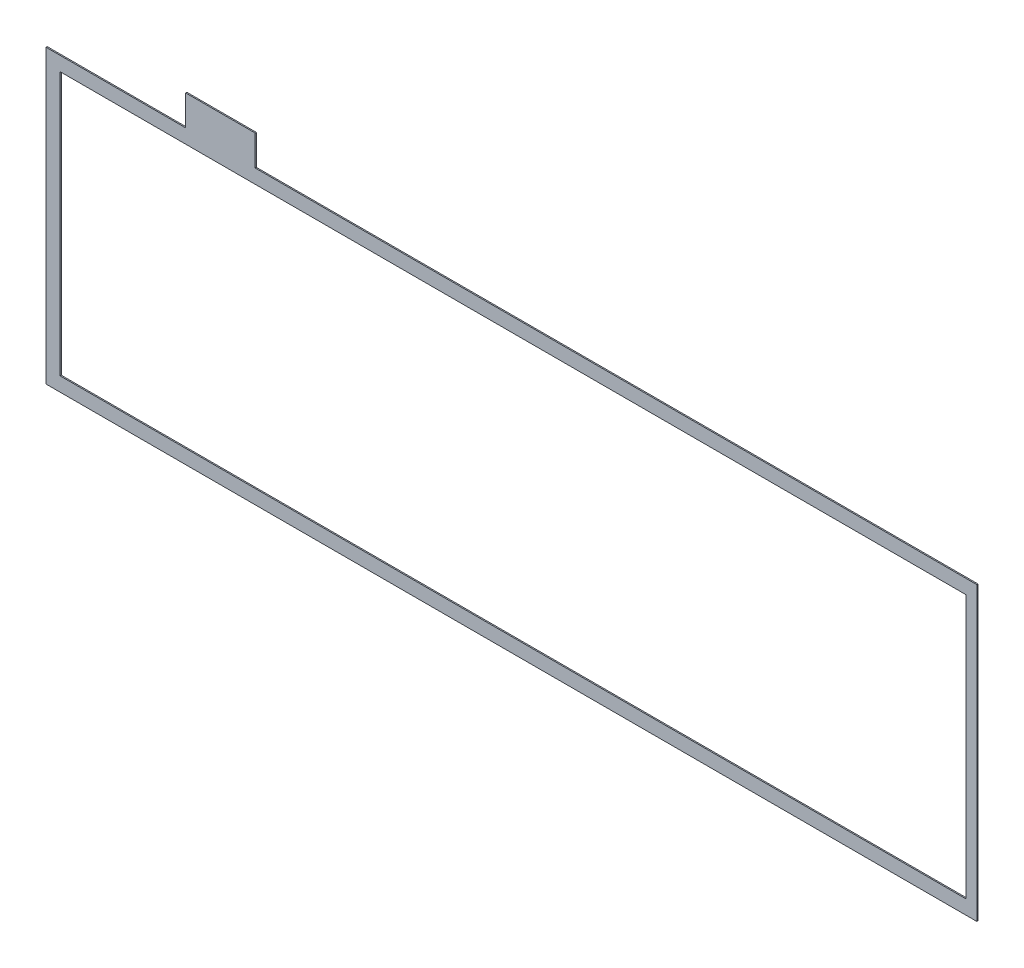
ISO-10303-21;
HEADER;
FILE_DESCRIPTION(('STEP AP214'),'2;1');
FILE_NAME('part.step','',(''),(''),'','','');
FILE_SCHEMA(('AUTOMOTIVE_DESIGN { 1 0 10303 214 1 1 1 1 }'));
ENDSEC;
DATA;
#1=APPLICATION_CONTEXT('core data for automotive mechanical design processes');
#2=APPLICATION_PROTOCOL_DEFINITION('international standard','automotive_design',2000,#1);
#3=PRODUCT_CONTEXT('',#1,'mechanical');
#4=PRODUCT('Part','Part','',(#3));
#5=PRODUCT_RELATED_PRODUCT_CATEGORY('part','',(#4));
#6=PRODUCT_DEFINITION_FORMATION('','',#4);
#7=PRODUCT_DEFINITION_CONTEXT('part definition',#1,'design');
#8=PRODUCT_DEFINITION('design','',#6,#7);
#9=PRODUCT_DEFINITION_SHAPE('','',#8);
#10=(LENGTH_UNIT() NAMED_UNIT(*) SI_UNIT(.MILLI.,.METRE.));
#11=(NAMED_UNIT(*) PLANE_ANGLE_UNIT() SI_UNIT($,.RADIAN.));
#12=(NAMED_UNIT(*) SI_UNIT($,.STERADIAN.) SOLID_ANGLE_UNIT());
#13=UNCERTAINTY_MEASURE_WITH_UNIT(LENGTH_MEASURE(1.E-05),#10,'distance_accuracy_value','');
#14=(GEOMETRIC_REPRESENTATION_CONTEXT(3) GLOBAL_UNCERTAINTY_ASSIGNED_CONTEXT((#13)) GLOBAL_UNIT_ASSIGNED_CONTEXT((#10,
#11,#12)) REPRESENTATION_CONTEXT('',''));
#15=CARTESIAN_POINT('',(0.,0.,0.));
#16=DIRECTION('',(0.,0.,1.));
#17=DIRECTION('',(1.,0.,0.));
#18=AXIS2_PLACEMENT_3D('',#15,#16,#17);
#19=CARTESIAN_POINT('',(-1.79365765613,40.102950579298,0.01));
#20=DIRECTION('',(0.,0.,1.));
#21=DIRECTION('',(1.,0.,0.));
#22=AXIS2_PLACEMENT_3D('',#19,#20,#21);
#23=PLANE('',#22);
#24=DIRECTION('',(0.,1.,0.));
#25=VECTOR('',#24,1.);
#26=CARTESIAN_POINT('',(-5.600483644553,38.964048,0.01));
#27=LINE('',#26,#25);
#28=CARTESIAN_POINT('',(-5.600483644553,38.964048,0.01));
#29=VERTEX_POINT('',#28);
#30=CARTESIAN_POINT('',(-5.600483644553,41.200314,0.01));
#31=VERTEX_POINT('',#30);
#32=EDGE_CURVE('E225',#29,#31,#27,.T.);
#33=ORIENTED_EDGE('',*,*,#32,.T.);
#34=DIRECTION('',(1.,0.,0.));
#35=VECTOR('',#34,1.);
#36=CARTESIAN_POINT('',(-5.600483644553,41.200314,0.01));
#37=LINE('',#36,#35);
#38=CARTESIAN_POINT('',(2.089516,41.200314,0.01));
#39=VERTEX_POINT('',#38);
#40=EDGE_CURVE('E198',#31,#39,#37,.T.);
#41=ORIENTED_EDGE('',*,*,#40,.T.);
#42=DIRECTION('',(0.,-1.,0.));
#43=VECTOR('',#42,1.);
#44=CARTESIAN_POINT('',(2.089516,41.200314,0.01));
#45=LINE('',#44,#43);
#46=CARTESIAN_POINT('',(2.089516,38.964048,0.01));
#47=VERTEX_POINT('',#46);
#48=EDGE_CURVE('E183',#39,#47,#45,.T.);
#49=ORIENTED_EDGE('',*,*,#48,.T.);
#50=DIRECTION('',(1.,0.,0.));
#51=VECTOR('',#50,1.);
#52=CARTESIAN_POINT('',(-5.600483644553,38.964048,0.01));
#53=LINE('',#52,#51);
#54=EDGE_CURVE('E26',#29,#47,#53,.T.);
#55=ORIENTED_EDGE('',*,*,#54,.F.);
#56=EDGE_LOOP('',(#33,#41,#49,#55));
#57=FACE_BOUND('',#56,.T.);
#58=DIRECTION('',(1.,0.,0.));
#59=VECTOR('',#58,1.);
#60=CARTESIAN_POINT('',(-3.944431,41.320314,0.01));
#61=LINE('',#60,#59);
#62=CARTESIAN_POINT('',(-3.944431,41.320314,0.01));
#63=VERTEX_POINT('',#62);
#64=CARTESIAN_POINT('',(2.181274355447,41.320314,0.01));
#65=VERTEX_POINT('',#64);
#66=EDGE_CURVE('E248',#63,#65,#61,.T.);
#67=ORIENTED_EDGE('',*,*,#66,.F.);
#68=DIRECTION('',(0.,1.,0.));
#69=VECTOR('',#68,1.);
#70=CARTESIAN_POINT('',(-3.944431,41.320314,0.01));
#71=LINE('',#70,#69);
#72=CARTESIAN_POINT('',(-3.944431,41.577274,0.01));
#73=VERTEX_POINT('',#72);
#74=EDGE_CURVE('E214',#63,#73,#71,.T.);
#75=ORIENTED_EDGE('',*,*,#74,.T.);
#76=DIRECTION('',(-1.,0.,0.));
#77=VECTOR('',#76,1.);
#78=CARTESIAN_POINT('',(-3.944431,41.577274,0.01));
#79=LINE('',#78,#77);
#80=CARTESIAN_POINT('',(-4.535057,41.577274,0.01));
#81=VERTEX_POINT('',#80);
#82=EDGE_CURVE('E206',#73,#81,#79,.T.);
#83=ORIENTED_EDGE('',*,*,#82,.T.);
#84=DIRECTION('',(0.,-1.,0.));
#85=VECTOR('',#84,1.);
#86=CARTESIAN_POINT('',(-4.535057,41.577274,0.01));
#87=LINE('',#86,#85);
#88=CARTESIAN_POINT('',(-4.535057,41.320314,0.01));
#89=VERTEX_POINT('',#88);
#90=EDGE_CURVE('E190',#81,#89,#87,.T.);
#91=ORIENTED_EDGE('',*,*,#90,.T.);
#92=DIRECTION('',(1.,0.,0.));
#93=VECTOR('',#92,1.);
#94=CARTESIAN_POINT('',(-5.720483644553,41.320314,0.01));
#95=LINE('',#94,#93);
#96=CARTESIAN_POINT('',(-5.720483644553,41.320314,0.01));
#97=VERTEX_POINT('',#96);
#98=EDGE_CURVE('E148',#97,#89,#95,.T.);
#99=ORIENTED_EDGE('',*,*,#98,.F.);
#100=DIRECTION('',(0.,1.,0.));
#101=VECTOR('',#100,1.);
#102=CARTESIAN_POINT('',(-5.720483644553,38.844048,0.01));
#103=LINE('',#102,#101);
#104=CARTESIAN_POINT('',(-5.720483644553,38.844048,0.01));
#105=VERTEX_POINT('',#104);
#106=EDGE_CURVE('E159',#105,#97,#103,.T.);
#107=ORIENTED_EDGE('',*,*,#106,.F.);
#108=DIRECTION('',(-1.,0.,0.));
#109=VECTOR('',#108,1.);
#110=CARTESIAN_POINT('',(2.181274355447,38.844048,0.01));
#111=LINE('',#110,#109);
#112=CARTESIAN_POINT('',(2.181274355447,38.844048,0.01));
#113=VERTEX_POINT('',#112);
#114=EDGE_CURVE('E162',#113,#105,#111,.T.);
#115=ORIENTED_EDGE('',*,*,#114,.F.);
#116=DIRECTION('',(0.,-1.,0.));
#117=VECTOR('',#116,1.);
#118=CARTESIAN_POINT('',(2.181274355447,41.320314,0.01));
#119=LINE('',#118,#117);
#120=EDGE_CURVE('E264',#65,#113,#119,.T.);
#121=ORIENTED_EDGE('',*,*,#120,.F.);
#122=EDGE_LOOP('',(#67,#75,#83,#91,#99,#107,#115,#121));
#123=FACE_BOUND('',#122,.T.);
#124=ADVANCED_FACE('F17',(#57,#123),#23,.T.);
#125=CARTESIAN_POINT('',(-1.79365765613,40.102950579298,0.));
#126=DIRECTION('',(0.,0.,1.));
#127=DIRECTION('',(1.,0.,0.));
#128=AXIS2_PLACEMENT_3D('',#125,#126,#127);
#129=PLANE('',#128);
#130=DIRECTION('',(0.,1.,0.));
#131=VECTOR('',#130,1.);
#132=CARTESIAN_POINT('',(-5.600483644553,38.964048,0.));
#133=LINE('',#132,#131);
#134=CARTESIAN_POINT('',(-5.600483644553,38.964048,0.));
#135=VERTEX_POINT('',#134);
#136=CARTESIAN_POINT('',(-5.600483644553,41.200314,0.));
#137=VERTEX_POINT('',#136);
#138=EDGE_CURVE('E220',#135,#137,#133,.T.);
#139=ORIENTED_EDGE('',*,*,#138,.F.);
#140=DIRECTION('',(1.,0.,0.));
#141=VECTOR('',#140,1.);
#142=CARTESIAN_POINT('',(-5.600483644553,38.964048,0.));
#143=LINE('',#142,#141);
#144=CARTESIAN_POINT('',(2.089516,38.964048,0.));
#145=VERTEX_POINT('',#144);
#146=EDGE_CURVE('E11',#135,#145,#143,.T.);
#147=ORIENTED_EDGE('',*,*,#146,.T.);
#148=DIRECTION('',(0.,-1.,0.));
#149=VECTOR('',#148,1.);
#150=CARTESIAN_POINT('',(2.089516,41.200314,0.));
#151=LINE('',#150,#149);
#152=CARTESIAN_POINT('',(2.089516,41.200314,0.));
#153=VERTEX_POINT('',#152);
#154=EDGE_CURVE('E202',#153,#145,#151,.T.);
#155=ORIENTED_EDGE('',*,*,#154,.F.);
#156=DIRECTION('',(1.,0.,0.));
#157=VECTOR('',#156,1.);
#158=CARTESIAN_POINT('',(-5.600483644553,41.200314,0.));
#159=LINE('',#158,#157);
#160=EDGE_CURVE('E229',#137,#153,#159,.T.);
#161=ORIENTED_EDGE('',*,*,#160,.F.);
#162=EDGE_LOOP('',(#139,#147,#155,#161));
#163=FACE_BOUND('',#162,.T.);
#164=DIRECTION('',(1.,0.,0.));
#165=VECTOR('',#164,1.);
#166=CARTESIAN_POINT('',(-3.944431,41.320314,0.));
#167=LINE('',#166,#165);
#168=CARTESIAN_POINT('',(-3.944431,41.320314,0.));
#169=VERTEX_POINT('',#168);
#170=CARTESIAN_POINT('',(2.181274355447,41.320314,0.));
#171=VERTEX_POINT('',#170);
#172=EDGE_CURVE('E253',#169,#171,#167,.T.);
#173=ORIENTED_EDGE('',*,*,#172,.T.);
#174=DIRECTION('',(0.,-1.,0.));
#175=VECTOR('',#174,1.);
#176=CARTESIAN_POINT('',(2.181274355447,41.320314,0.));
#177=LINE('',#176,#175);
#178=CARTESIAN_POINT('',(2.181274355447,38.844048,0.));
#179=VERTEX_POINT('',#178);
#180=EDGE_CURVE('E154',#171,#179,#177,.T.);
#181=ORIENTED_EDGE('',*,*,#180,.T.);
#182=DIRECTION('',(-1.,0.,0.));
#183=VECTOR('',#182,1.);
#184=CARTESIAN_POINT('',(2.181274355447,38.844048,0.));
#185=LINE('',#184,#183);
#186=CARTESIAN_POINT('',(-5.720483644553,38.844048,0.));
#187=VERTEX_POINT('',#186);
#188=EDGE_CURVE('E151',#179,#187,#185,.T.);
#189=ORIENTED_EDGE('',*,*,#188,.T.);
#190=DIRECTION('',(0.,1.,0.));
#191=VECTOR('',#190,1.);
#192=CARTESIAN_POINT('',(-5.720483644553,38.844048,0.));
#193=LINE('',#192,#191);
#194=CARTESIAN_POINT('',(-5.720483644553,41.320314,0.));
#195=VERTEX_POINT('',#194);
#196=EDGE_CURVE('E136',#187,#195,#193,.T.);
#197=ORIENTED_EDGE('',*,*,#196,.T.);
#198=DIRECTION('',(1.,0.,0.));
#199=VECTOR('',#198,1.);
#200=CARTESIAN_POINT('',(-5.720483644553,41.320314,0.));
#201=LINE('',#200,#199);
#202=CARTESIAN_POINT('',(-4.535057,41.320314,0.));
#203=VERTEX_POINT('',#202);
#204=EDGE_CURVE('E177',#195,#203,#201,.T.);
#205=ORIENTED_EDGE('',*,*,#204,.T.);
#206=DIRECTION('',(0.,-1.,0.));
#207=VECTOR('',#206,1.);
#208=CARTESIAN_POINT('',(-4.535057,41.577274,0.));
#209=LINE('',#208,#207);
#210=CARTESIAN_POINT('',(-4.535057,41.577274,0.));
#211=VERTEX_POINT('',#210);
#212=EDGE_CURVE('E187',#211,#203,#209,.T.);
#213=ORIENTED_EDGE('',*,*,#212,.F.);
#214=DIRECTION('',(-1.,0.,0.));
#215=VECTOR('',#214,1.);
#216=CARTESIAN_POINT('',(-3.944431,41.577274,0.));
#217=LINE('',#216,#215);
#218=CARTESIAN_POINT('',(-3.944431,41.577274,0.));
#219=VERTEX_POINT('',#218);
#220=EDGE_CURVE('E196',#219,#211,#217,.T.);
#221=ORIENTED_EDGE('',*,*,#220,.F.);
#222=DIRECTION('',(0.,1.,0.));
#223=VECTOR('',#222,1.);
#224=CARTESIAN_POINT('',(-3.944431,41.320314,0.));
#225=LINE('',#224,#223);
#226=EDGE_CURVE('E209',#169,#219,#225,.T.);
#227=ORIENTED_EDGE('',*,*,#226,.F.);
#228=EDGE_LOOP('',(#173,#181,#189,#197,#205,#213,#221,#227));
#229=FACE_BOUND('',#228,.T.);
#230=ADVANCED_FACE('F153',(#163,#229),#129,.F.);
#231=CARTESIAN_POINT('',(-5.600483644553,38.964048,0.));
#232=DIRECTION('',(0.,1.,0.));
#233=DIRECTION('',(1.,0.,0.));
#234=AXIS2_PLACEMENT_3D('',#231,#232,#233);
#235=PLANE('',#234);
#236=DIRECTION('',(0.,0.,1.));
#237=VECTOR('',#236,1.);
#238=CARTESIAN_POINT('',(-5.600483644553,38.964048,0.));
#239=LINE('',#238,#237);
#240=EDGE_CURVE('E217',#135,#29,#239,.T.);
#241=ORIENTED_EDGE('',*,*,#240,.T.);
#242=ORIENTED_EDGE('',*,*,#54,.T.);
#243=DIRECTION('',(0.,0.,1.));
#244=VECTOR('',#243,1.);
#245=CARTESIAN_POINT('',(2.089516,38.964048,0.));
#246=LINE('',#245,#244);
#247=EDGE_CURVE('E20',#145,#47,#246,.T.);
#248=ORIENTED_EDGE('',*,*,#247,.F.);
#249=ORIENTED_EDGE('',*,*,#146,.F.);
#250=EDGE_LOOP('',(#241,#242,#248,#249));
#251=FACE_BOUND('',#250,.T.);
#252=ADVANCED_FACE('F327',(#251),#235,.T.);
#253=CARTESIAN_POINT('',(2.089516,41.200314,0.));
#254=DIRECTION('',(1.,0.,0.));
#255=DIRECTION('',(0.,1.,0.));
#256=AXIS2_PLACEMENT_3D('',#253,#254,#255);
#257=PLANE('',#256);
#258=DIRECTION('',(0.,0.,1.));
#259=VECTOR('',#258,1.);
#260=CARTESIAN_POINT('',(2.089516,41.200314,0.));
#261=LINE('',#260,#259);
#262=EDGE_CURVE('E203',#153,#39,#261,.T.);
#263=ORIENTED_EDGE('',*,*,#262,.F.);
#264=ORIENTED_EDGE('',*,*,#154,.T.);
#265=ORIENTED_EDGE('',*,*,#247,.T.);
#266=ORIENTED_EDGE('',*,*,#48,.F.);
#267=EDGE_LOOP('',(#263,#264,#265,#266));
#268=FACE_BOUND('',#267,.T.);
#269=ADVANCED_FACE('F334',(#268),#257,.F.);
#270=CARTESIAN_POINT('',(-5.600483644553,41.200314,0.));
#271=DIRECTION('',(0.,1.,0.));
#272=DIRECTION('',(1.,0.,0.));
#273=AXIS2_PLACEMENT_3D('',#270,#271,#272);
#274=PLANE('',#273);
#275=DIRECTION('',(0.,0.,1.));
#276=VECTOR('',#275,1.);
#277=CARTESIAN_POINT('',(-5.600483644553,41.200314,0.));
#278=LINE('',#277,#276);
#279=EDGE_CURVE('E224',#137,#31,#278,.T.);
#280=ORIENTED_EDGE('',*,*,#279,.F.);
#281=ORIENTED_EDGE('',*,*,#160,.T.);
#282=ORIENTED_EDGE('',*,*,#262,.T.);
#283=ORIENTED_EDGE('',*,*,#40,.F.);
#284=EDGE_LOOP('',(#280,#281,#282,#283));
#285=FACE_BOUND('',#284,.T.);
#286=ADVANCED_FACE('F332',(#285),#274,.F.);
#287=CARTESIAN_POINT('',(-5.600483644553,38.964048,0.));
#288=DIRECTION('',(-1.,0.,0.));
#289=DIRECTION('',(0.,0.,1.));
#290=AXIS2_PLACEMENT_3D('',#287,#288,#289);
#291=PLANE('',#290);
#292=ORIENTED_EDGE('',*,*,#240,.F.);
#293=ORIENTED_EDGE('',*,*,#138,.T.);
#294=ORIENTED_EDGE('',*,*,#279,.T.);
#295=ORIENTED_EDGE('',*,*,#32,.F.);
#296=EDGE_LOOP('',(#292,#293,#294,#295));
#297=FACE_BOUND('',#296,.T.);
#298=ADVANCED_FACE('F331',(#297),#291,.F.);
#299=CARTESIAN_POINT('',(-3.944431,41.320314,0.));
#300=DIRECTION('',(-1.,0.,0.));
#301=DIRECTION('',(0.,0.,1.));
#302=AXIS2_PLACEMENT_3D('',#299,#300,#301);
#303=PLANE('',#302);
#304=DIRECTION('',(0.,0.,1.));
#305=VECTOR('',#304,1.);
#306=CARTESIAN_POINT('',(-3.944431,41.320314,0.));
#307=LINE('',#306,#305);
#308=EDGE_CURVE('E245',#169,#63,#307,.T.);
#309=ORIENTED_EDGE('',*,*,#308,.F.);
#310=ORIENTED_EDGE('',*,*,#226,.T.);
#311=DIRECTION('',(0.,0.,1.));
#312=VECTOR('',#311,1.);
#313=CARTESIAN_POINT('',(-3.944431,41.577274,0.));
#314=LINE('',#313,#312);
#315=EDGE_CURVE('E193',#219,#73,#314,.T.);
#316=ORIENTED_EDGE('',*,*,#315,.T.);
#317=ORIENTED_EDGE('',*,*,#74,.F.);
#318=EDGE_LOOP('',(#309,#310,#316,#317));
#319=FACE_BOUND('',#318,.T.);
#320=ADVANCED_FACE('F305',(#319),#303,.F.);
#321=CARTESIAN_POINT('',(-3.944431,41.577274,0.));
#322=DIRECTION('',(0.,-1.,0.));
#323=DIRECTION('',(0.,0.,-1.));
#324=AXIS2_PLACEMENT_3D('',#321,#322,#323);
#325=PLANE('',#324);
#326=ORIENTED_EDGE('',*,*,#315,.F.);
#327=ORIENTED_EDGE('',*,*,#220,.T.);
#328=DIRECTION('',(0.,0.,1.));
#329=VECTOR('',#328,1.);
#330=CARTESIAN_POINT('',(-4.535057,41.577274,0.));
#331=LINE('',#330,#329);
#332=EDGE_CURVE('E180',#211,#81,#331,.T.);
#333=ORIENTED_EDGE('',*,*,#332,.T.);
#334=ORIENTED_EDGE('',*,*,#82,.F.);
#335=EDGE_LOOP('',(#326,#327,#333,#334));
#336=FACE_BOUND('',#335,.T.);
#337=ADVANCED_FACE('F302',(#336),#325,.F.);
#338=CARTESIAN_POINT('',(-4.535057,41.577274,0.));
#339=DIRECTION('',(1.,0.,0.));
#340=DIRECTION('',(0.,1.,0.));
#341=AXIS2_PLACEMENT_3D('',#338,#339,#340);
#342=PLANE('',#341);
#343=ORIENTED_EDGE('',*,*,#332,.F.);
#344=ORIENTED_EDGE('',*,*,#212,.T.);
#345=DIRECTION('',(0.,0.,1.));
#346=VECTOR('',#345,1.);
#347=CARTESIAN_POINT('',(-4.535057,41.320314,0.));
#348=LINE('',#347,#346);
#349=EDGE_CURVE('E173',#203,#89,#348,.T.);
#350=ORIENTED_EDGE('',*,*,#349,.T.);
#351=ORIENTED_EDGE('',*,*,#90,.F.);
#352=EDGE_LOOP('',(#343,#344,#350,#351));
#353=FACE_BOUND('',#352,.T.);
#354=ADVANCED_FACE('F299',(#353),#342,.F.);
#355=CARTESIAN_POINT('',(-5.720483644553,41.320314,0.));
#356=DIRECTION('',(0.,1.,0.));
#357=DIRECTION('',(1.,0.,0.));
#358=AXIS2_PLACEMENT_3D('',#355,#356,#357);
#359=PLANE('',#358);
#360=DIRECTION('',(0.,0.,1.));
#361=VECTOR('',#360,1.);
#362=CARTESIAN_POINT('',(-5.720483644553,41.320314,0.));
#363=LINE('',#362,#361);
#364=EDGE_CURVE('E144',#195,#97,#363,.T.);
#365=ORIENTED_EDGE('',*,*,#364,.T.);
#366=ORIENTED_EDGE('',*,*,#98,.T.);
#367=ORIENTED_EDGE('',*,*,#349,.F.);
#368=ORIENTED_EDGE('',*,*,#204,.F.);
#369=EDGE_LOOP('',(#365,#366,#367,#368));
#370=FACE_BOUND('',#369,.T.);
#371=ADVANCED_FACE('F293',(#370),#359,.T.);
#372=CARTESIAN_POINT('',(-5.720483644553,38.844048,0.));
#373=DIRECTION('',(-1.,0.,0.));
#374=DIRECTION('',(0.,0.,1.));
#375=AXIS2_PLACEMENT_3D('',#372,#373,#374);
#376=PLANE('',#375);
#377=DIRECTION('',(0.,0.,1.));
#378=VECTOR('',#377,1.);
#379=CARTESIAN_POINT('',(-5.720483644553,38.844048,0.));
#380=LINE('',#379,#378);
#381=EDGE_CURVE('E141',#187,#105,#380,.T.);
#382=ORIENTED_EDGE('',*,*,#381,.T.);
#383=ORIENTED_EDGE('',*,*,#106,.T.);
#384=ORIENTED_EDGE('',*,*,#364,.F.);
#385=ORIENTED_EDGE('',*,*,#196,.F.);
#386=EDGE_LOOP('',(#382,#383,#384,#385));
#387=FACE_BOUND('',#386,.T.);
#388=ADVANCED_FACE('F138',(#387),#376,.T.);
#389=CARTESIAN_POINT('',(2.181274355447,38.844048,0.));
#390=DIRECTION('',(0.,-1.,0.));
#391=DIRECTION('',(0.,0.,-1.));
#392=AXIS2_PLACEMENT_3D('',#389,#390,#391);
#393=PLANE('',#392);
#394=DIRECTION('',(0.,0.,1.));
#395=VECTOR('',#394,1.);
#396=CARTESIAN_POINT('',(2.181274355447,38.844048,0.));
#397=LINE('',#396,#395);
#398=EDGE_CURVE('E268',#179,#113,#397,.T.);
#399=ORIENTED_EDGE('',*,*,#398,.T.);
#400=ORIENTED_EDGE('',*,*,#114,.T.);
#401=ORIENTED_EDGE('',*,*,#381,.F.);
#402=ORIENTED_EDGE('',*,*,#188,.F.);
#403=EDGE_LOOP('',(#399,#400,#401,#402));
#404=FACE_BOUND('',#403,.T.);
#405=ADVANCED_FACE('F161',(#404),#393,.T.);
#406=CARTESIAN_POINT('',(2.181274355447,41.320314,0.));
#407=DIRECTION('',(1.,0.,0.));
#408=DIRECTION('',(0.,1.,0.));
#409=AXIS2_PLACEMENT_3D('',#406,#407,#408);
#410=PLANE('',#409);
#411=DIRECTION('',(0.,0.,1.));
#412=VECTOR('',#411,1.);
#413=CARTESIAN_POINT('',(2.181274355447,41.320314,0.));
#414=LINE('',#413,#412);
#415=EDGE_CURVE('E249',#171,#65,#414,.T.);
#416=ORIENTED_EDGE('',*,*,#415,.T.);
#417=ORIENTED_EDGE('',*,*,#120,.T.);
#418=ORIENTED_EDGE('',*,*,#398,.F.);
#419=ORIENTED_EDGE('',*,*,#180,.F.);
#420=EDGE_LOOP('',(#416,#417,#418,#419));
#421=FACE_BOUND('',#420,.T.);
#422=ADVANCED_FACE('F311',(#421),#410,.T.);
#423=CARTESIAN_POINT('',(-3.944431,41.320314,0.));
#424=DIRECTION('',(0.,1.,0.));
#425=DIRECTION('',(1.,0.,0.));
#426=AXIS2_PLACEMENT_3D('',#423,#424,#425);
#427=PLANE('',#426);
#428=ORIENTED_EDGE('',*,*,#308,.T.);
#429=ORIENTED_EDGE('',*,*,#66,.T.);
#430=ORIENTED_EDGE('',*,*,#415,.F.);
#431=ORIENTED_EDGE('',*,*,#172,.F.);
#432=EDGE_LOOP('',(#428,#429,#430,#431));
#433=FACE_BOUND('',#432,.T.);
#434=ADVANCED_FACE('F309',(#433),#427,.T.);
#435=CLOSED_SHELL('',(#124,#230,#252,#269,#286,#298,#320,#337,#354,#371,#388,#405,#422,#434));
#436=MANIFOLD_SOLID_BREP('B1',#435);
#437=ADVANCED_BREP_SHAPE_REPRESENTATION('',(#18,#436),#14);
#438=SHAPE_DEFINITION_REPRESENTATION(#9,#437);
ENDSEC;
END-ISO-10303-21;
